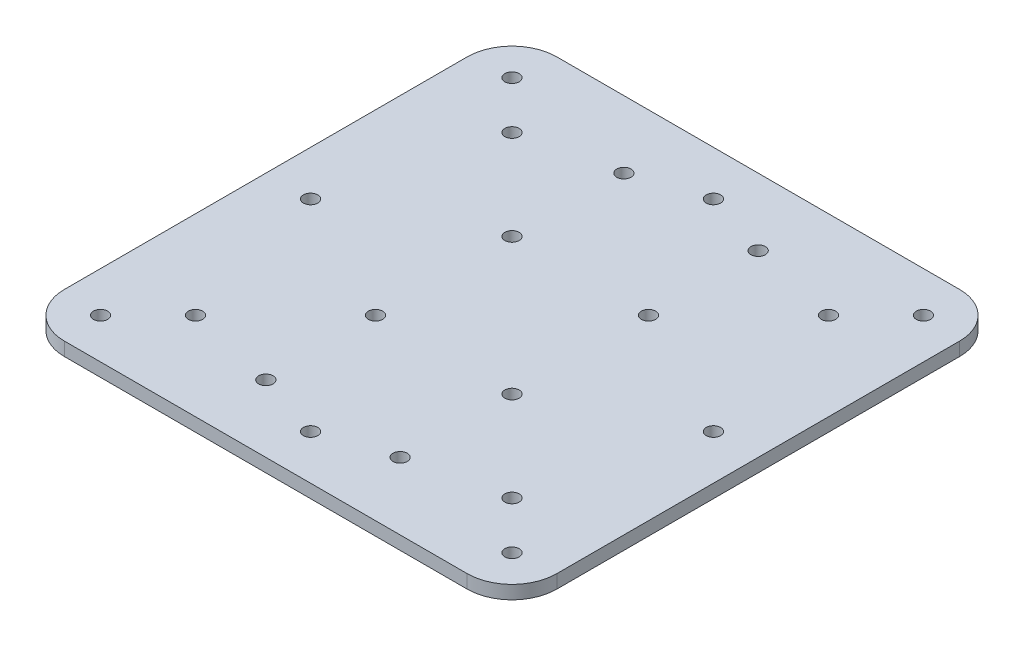
ISO-10303-21;
HEADER;
FILE_DESCRIPTION(('STEP AP214'),'2;1');
FILE_NAME('part.step','',(''),(''),'','','');
FILE_SCHEMA(('AUTOMOTIVE_DESIGN { 1 0 10303 214 1 1 1 1 }'));
ENDSEC;
DATA;
#1=APPLICATION_CONTEXT('core data for automotive mechanical design processes');
#2=APPLICATION_PROTOCOL_DEFINITION('international standard','automotive_design',2000,#1);
#3=PRODUCT_CONTEXT('',#1,'mechanical');
#4=PRODUCT('Part','Part','',(#3));
#5=PRODUCT_RELATED_PRODUCT_CATEGORY('part','',(#4));
#6=PRODUCT_DEFINITION_FORMATION('','',#4);
#7=PRODUCT_DEFINITION_CONTEXT('part definition',#1,'design');
#8=PRODUCT_DEFINITION('design','',#6,#7);
#9=PRODUCT_DEFINITION_SHAPE('','',#8);
#10=(LENGTH_UNIT() NAMED_UNIT(*) SI_UNIT(.MILLI.,.METRE.));
#11=(NAMED_UNIT(*) PLANE_ANGLE_UNIT() SI_UNIT($,.RADIAN.));
#12=(NAMED_UNIT(*) SI_UNIT($,.STERADIAN.) SOLID_ANGLE_UNIT());
#13=UNCERTAINTY_MEASURE_WITH_UNIT(LENGTH_MEASURE(1.E-05),#10,'distance_accuracy_value','');
#14=(GEOMETRIC_REPRESENTATION_CONTEXT(3) GLOBAL_UNCERTAINTY_ASSIGNED_CONTEXT((#13)) GLOBAL_UNIT_ASSIGNED_CONTEXT((#10,
#11,#12)) REPRESENTATION_CONTEXT('',''));
#15=CARTESIAN_POINT('',(0.,0.,0.));
#16=DIRECTION('',(0.,0.,1.));
#17=DIRECTION('',(1.,0.,0.));
#18=AXIS2_PLACEMENT_3D('',#15,#16,#17);
#19=CARTESIAN_POINT('',(0.,3.,0.));
#20=DIRECTION('',(0.,1.,0.));
#21=DIRECTION('',(0.,0.,1.));
#22=AXIS2_PLACEMENT_3D('',#19,#20,#21);
#23=PLANE('',#22);
#24=CARTESIAN_POINT('',(-15.,3.,-40.));
#25=DIRECTION('',(0.,1.,0.));
#26=DIRECTION('',(0.,0.,1.));
#27=AXIS2_PLACEMENT_3D('',#24,#25,#26);
#28=CIRCLE('',#27,1.6);
#29=CARTESIAN_POINT('',(-15.,3.,-38.4));
#30=VERTEX_POINT('',#29);
#31=EDGE_CURVE('E286',#30,#30,#28,.T.);
#32=ORIENTED_EDGE('',*,*,#31,.F.);
#33=EDGE_LOOP('',(#32));
#34=FACE_BOUND('',#33,.T.);
#35=CARTESIAN_POINT('',(-15.,3.,40.));
#36=DIRECTION('',(0.,1.,0.));
#37=DIRECTION('',(0.,0.,1.));
#38=AXIS2_PLACEMENT_3D('',#35,#36,#37);
#39=CIRCLE('',#38,1.6);
#40=CARTESIAN_POINT('',(-15.,3.,41.6));
#41=VERTEX_POINT('',#40);
#42=EDGE_CURVE('E277',#41,#41,#39,.T.);
#43=ORIENTED_EDGE('',*,*,#42,.F.);
#44=EDGE_LOOP('',(#43));
#45=FACE_BOUND('',#44,.T.);
#46=CARTESIAN_POINT('',(45.,3.,0.));
#47=DIRECTION('',(0.,1.,0.));
#48=DIRECTION('',(0.,0.,1.));
#49=AXIS2_PLACEMENT_3D('',#46,#47,#48);
#50=CIRCLE('',#49,1.6);
#51=CARTESIAN_POINT('',(45.,3.,1.6));
#52=VERTEX_POINT('',#51);
#53=EDGE_CURVE('E262',#52,#52,#50,.T.);
#54=ORIENTED_EDGE('',*,*,#53,.F.);
#55=EDGE_LOOP('',(#54));
#56=FACE_BOUND('',#55,.T.);
#57=CARTESIAN_POINT('',(0.,3.,-45.));
#58=DIRECTION('',(0.,1.,0.));
#59=DIRECTION('',(0.,0.,1.));
#60=AXIS2_PLACEMENT_3D('',#57,#58,#59);
#61=CIRCLE('',#60,1.6);
#62=CARTESIAN_POINT('',(0.,3.,-43.4));
#63=VERTEX_POINT('',#62);
#64=EDGE_CURVE('E252',#63,#63,#61,.T.);
#65=ORIENTED_EDGE('',*,*,#64,.F.);
#66=EDGE_LOOP('',(#65));
#67=FACE_BOUND('',#66,.T.);
#68=CARTESIAN_POINT('',(-45.9619,3.,45.9619));
#69=DIRECTION('',(0.,1.,0.));
#70=DIRECTION('',(0.,0.,1.));
#71=AXIS2_PLACEMENT_3D('',#68,#69,#70);
#72=CIRCLE('',#71,1.6);
#73=CARTESIAN_POINT('',(-45.9619,3.,47.5619));
#74=VERTEX_POINT('',#73);
#75=EDGE_CURVE('E238',#74,#74,#72,.T.);
#76=ORIENTED_EDGE('',*,*,#75,.F.);
#77=EDGE_LOOP('',(#76));
#78=FACE_BOUND('',#77,.T.);
#79=CARTESIAN_POINT('',(45.9619,3.,45.9619));
#80=DIRECTION('',(0.,1.,0.));
#81=DIRECTION('',(0.,0.,-1.));
#82=AXIS2_PLACEMENT_3D('',#79,#80,#81);
#83=CIRCLE('',#82,1.6);
#84=CARTESIAN_POINT('',(45.9619,3.,44.3619));
#85=VERTEX_POINT('',#84);
#86=EDGE_CURVE('E230',#85,#85,#83,.T.);
#87=ORIENTED_EDGE('',*,*,#86,.F.);
#88=EDGE_LOOP('',(#87));
#89=FACE_BOUND('',#88,.T.);
#90=CARTESIAN_POINT('',(-35.3553,3.,-35.3553));
#91=DIRECTION('',(0.,1.,0.));
#92=DIRECTION('',(0.,0.,-1.));
#93=AXIS2_PLACEMENT_3D('',#90,#91,#92);
#94=CIRCLE('',#93,1.6);
#95=CARTESIAN_POINT('',(-35.3553,3.,-36.9553));
#96=VERTEX_POINT('',#95);
#97=EDGE_CURVE('E216',#96,#96,#94,.T.);
#98=ORIENTED_EDGE('',*,*,#97,.F.);
#99=EDGE_LOOP('',(#98));
#100=FACE_BOUND('',#99,.T.);
#101=CARTESIAN_POINT('',(35.3553,3.,-35.3553));
#102=DIRECTION('',(0.,1.,0.));
#103=DIRECTION('',(0.,0.,1.));
#104=AXIS2_PLACEMENT_3D('',#101,#102,#103);
#105=CIRCLE('',#104,1.6);
#106=CARTESIAN_POINT('',(35.3553,3.,-33.7553));
#107=VERTEX_POINT('',#106);
#108=EDGE_CURVE('E204',#107,#107,#105,.T.);
#109=ORIENTED_EDGE('',*,*,#108,.F.);
#110=EDGE_LOOP('',(#109));
#111=FACE_BOUND('',#110,.T.);
#112=CARTESIAN_POINT('',(-15.25,3.,15.25));
#113=DIRECTION('',(0.,1.,0.));
#114=DIRECTION('',(0.,0.,1.));
#115=AXIS2_PLACEMENT_3D('',#112,#113,#114);
#116=CIRCLE('',#115,1.6);
#117=CARTESIAN_POINT('',(-15.25,3.,16.85));
#118=VERTEX_POINT('',#117);
#119=EDGE_CURVE('E195',#118,#118,#116,.T.);
#120=ORIENTED_EDGE('',*,*,#119,.F.);
#121=EDGE_LOOP('',(#120));
#122=FACE_BOUND('',#121,.T.);
#123=CARTESIAN_POINT('',(15.25,3.,-15.25));
#124=DIRECTION('',(0.,1.,0.));
#125=DIRECTION('',(0.,0.,1.));
#126=AXIS2_PLACEMENT_3D('',#123,#124,#125);
#127=CIRCLE('',#126,1.6);
#128=CARTESIAN_POINT('',(15.25,3.,-13.65));
#129=VERTEX_POINT('',#128);
#130=EDGE_CURVE('E133',#129,#129,#127,.T.);
#131=ORIENTED_EDGE('',*,*,#130,.F.);
#132=EDGE_LOOP('',(#131));
#133=FACE_BOUND('',#132,.T.);
#134=DIRECTION('',(1.,0.,0.));
#135=VECTOR('',#134,1.);
#136=CARTESIAN_POINT('',(-55.,3.,55.));
#137=LINE('',#136,#135);
#138=CARTESIAN_POINT('',(-45.,3.,55.));
#139=VERTEX_POINT('',#138);
#140=CARTESIAN_POINT('',(45.,3.,55.));
#141=VERTEX_POINT('',#140);
#142=EDGE_CURVE('E141',#139,#141,#137,.T.);
#143=ORIENTED_EDGE('',*,*,#142,.T.);
#144=CARTESIAN_POINT('',(45.,3.,45.));
#145=DIRECTION('',(0.,1.,0.));
#146=DIRECTION('',(0.,0.,1.));
#147=AXIS2_PLACEMENT_3D('',#144,#145,#146);
#148=CIRCLE('',#147,10.);
#149=CARTESIAN_POINT('',(55.,3.,45.));
#150=VERTEX_POINT('',#149);
#151=EDGE_CURVE('E165',#141,#150,#148,.T.);
#152=ORIENTED_EDGE('',*,*,#151,.T.);
#153=DIRECTION('',(0.,0.,-1.));
#154=VECTOR('',#153,1.);
#155=CARTESIAN_POINT('',(55.,3.,-55.));
#156=LINE('',#155,#154);
#157=CARTESIAN_POINT('',(55.,3.,-45.));
#158=VERTEX_POINT('',#157);
#159=EDGE_CURVE('E127',#150,#158,#156,.T.);
#160=ORIENTED_EDGE('',*,*,#159,.T.);
#161=CARTESIAN_POINT('',(45.,3.,-45.));
#162=DIRECTION('',(0.,1.,0.));
#163=DIRECTION('',(0.,0.,1.));
#164=AXIS2_PLACEMENT_3D('',#161,#162,#163);
#165=CIRCLE('',#164,10.);
#166=CARTESIAN_POINT('',(45.,3.,-55.));
#167=VERTEX_POINT('',#166);
#168=EDGE_CURVE('E159',#158,#167,#165,.T.);
#169=ORIENTED_EDGE('',*,*,#168,.T.);
#170=DIRECTION('',(-1.,0.,0.));
#171=VECTOR('',#170,1.);
#172=CARTESIAN_POINT('',(-55.,3.,-55.));
#173=LINE('',#172,#171);
#174=CARTESIAN_POINT('',(-45.,3.,-55.));
#175=VERTEX_POINT('',#174);
#176=EDGE_CURVE('E185',#167,#175,#173,.T.);
#177=ORIENTED_EDGE('',*,*,#176,.T.);
#178=CARTESIAN_POINT('',(-45.,3.,-45.));
#179=DIRECTION('',(0.,1.,0.));
#180=DIRECTION('',(0.,0.,1.));
#181=AXIS2_PLACEMENT_3D('',#178,#179,#180);
#182=CIRCLE('',#181,10.);
#183=CARTESIAN_POINT('',(-55.,3.,-45.));
#184=VERTEX_POINT('',#183);
#185=EDGE_CURVE('E64',#175,#184,#182,.T.);
#186=ORIENTED_EDGE('',*,*,#185,.T.);
#187=DIRECTION('',(0.,0.,1.));
#188=VECTOR('',#187,1.);
#189=CARTESIAN_POINT('',(-55.,3.,-55.));
#190=LINE('',#189,#188);
#191=CARTESIAN_POINT('',(-55.,3.,45.));
#192=VERTEX_POINT('',#191);
#193=EDGE_CURVE('E171',#184,#192,#190,.T.);
#194=ORIENTED_EDGE('',*,*,#193,.T.);
#195=CARTESIAN_POINT('',(-45.,3.,45.));
#196=DIRECTION('',(0.,1.,0.));
#197=DIRECTION('',(0.,0.,1.));
#198=AXIS2_PLACEMENT_3D('',#195,#196,#197);
#199=CIRCLE('',#198,10.);
#200=EDGE_CURVE('E158',#192,#139,#199,.T.);
#201=ORIENTED_EDGE('',*,*,#200,.T.);
#202=EDGE_LOOP('',(#143,#152,#160,#169,#177,#186,#194,#201));
#203=FACE_BOUND('',#202,.T.);
#204=CARTESIAN_POINT('',(-15.25,3.,-15.25));
#205=DIRECTION('',(0.,1.,0.));
#206=DIRECTION('',(0.,0.,-1.));
#207=AXIS2_PLACEMENT_3D('',#204,#205,#206);
#208=CIRCLE('',#207,1.6);
#209=CARTESIAN_POINT('',(-15.25,3.,-16.85));
#210=VERTEX_POINT('',#209);
#211=EDGE_CURVE('E186',#210,#210,#208,.T.);
#212=ORIENTED_EDGE('',*,*,#211,.F.);
#213=EDGE_LOOP('',(#212));
#214=FACE_BOUND('',#213,.T.);
#215=CARTESIAN_POINT('',(15.25,3.,15.25));
#216=DIRECTION('',(0.,1.,0.));
#217=DIRECTION('',(0.,0.,-1.));
#218=AXIS2_PLACEMENT_3D('',#215,#216,#217);
#219=CIRCLE('',#218,1.6);
#220=CARTESIAN_POINT('',(15.25,3.,13.65));
#221=VERTEX_POINT('',#220);
#222=EDGE_CURVE('E196',#221,#221,#219,.T.);
#223=ORIENTED_EDGE('',*,*,#222,.F.);
#224=EDGE_LOOP('',(#223));
#225=FACE_BOUND('',#224,.T.);
#226=CARTESIAN_POINT('',(45.9619,3.,-45.9619));
#227=DIRECTION('',(0.,1.,0.));
#228=DIRECTION('',(0.,0.,1.));
#229=AXIS2_PLACEMENT_3D('',#226,#227,#228);
#230=CIRCLE('',#229,1.6);
#231=CARTESIAN_POINT('',(45.9619,3.,-44.3619));
#232=VERTEX_POINT('',#231);
#233=EDGE_CURVE('E209',#232,#232,#230,.T.);
#234=ORIENTED_EDGE('',*,*,#233,.F.);
#235=EDGE_LOOP('',(#234));
#236=FACE_BOUND('',#235,.T.);
#237=CARTESIAN_POINT('',(-45.9619,3.,-45.9619));
#238=DIRECTION('',(0.,1.,0.));
#239=DIRECTION('',(0.,0.,-1.));
#240=AXIS2_PLACEMENT_3D('',#237,#238,#239);
#241=CIRCLE('',#240,1.6);
#242=CARTESIAN_POINT('',(-45.9619,3.,-47.5619));
#243=VERTEX_POINT('',#242);
#244=EDGE_CURVE('E225',#243,#243,#241,.T.);
#245=ORIENTED_EDGE('',*,*,#244,.F.);
#246=EDGE_LOOP('',(#245));
#247=FACE_BOUND('',#246,.T.);
#248=CARTESIAN_POINT('',(35.3553,3.,35.3553));
#249=DIRECTION('',(0.,1.,0.));
#250=DIRECTION('',(0.,0.,-1.));
#251=AXIS2_PLACEMENT_3D('',#248,#249,#250);
#252=CIRCLE('',#251,1.6);
#253=CARTESIAN_POINT('',(35.3553,3.,33.7553));
#254=VERTEX_POINT('',#253);
#255=EDGE_CURVE('E232',#254,#254,#252,.T.);
#256=ORIENTED_EDGE('',*,*,#255,.F.);
#257=EDGE_LOOP('',(#256));
#258=FACE_BOUND('',#257,.T.);
#259=CARTESIAN_POINT('',(-35.3553,3.,35.3553));
#260=DIRECTION('',(0.,1.,0.));
#261=DIRECTION('',(0.,0.,1.));
#262=AXIS2_PLACEMENT_3D('',#259,#260,#261);
#263=CIRCLE('',#262,1.6);
#264=CARTESIAN_POINT('',(-35.3553,3.,36.9553));
#265=VERTEX_POINT('',#264);
#266=EDGE_CURVE('E248',#265,#265,#263,.T.);
#267=ORIENTED_EDGE('',*,*,#266,.F.);
#268=EDGE_LOOP('',(#267));
#269=FACE_BOUND('',#268,.T.);
#270=CARTESIAN_POINT('',(-45.,3.,0.));
#271=DIRECTION('',(0.,1.,0.));
#272=DIRECTION('',(0.,0.,1.));
#273=AXIS2_PLACEMENT_3D('',#270,#271,#272);
#274=CIRCLE('',#273,1.6);
#275=CARTESIAN_POINT('',(-45.,3.,1.6));
#276=VERTEX_POINT('',#275);
#277=EDGE_CURVE('E256',#276,#276,#274,.T.);
#278=ORIENTED_EDGE('',*,*,#277,.F.);
#279=EDGE_LOOP('',(#278));
#280=FACE_BOUND('',#279,.T.);
#281=CARTESIAN_POINT('',(0.,3.,45.));
#282=DIRECTION('',(0.,1.,0.));
#283=DIRECTION('',(0.,0.,1.));
#284=AXIS2_PLACEMENT_3D('',#281,#282,#283);
#285=CIRCLE('',#284,1.6);
#286=CARTESIAN_POINT('',(0.,3.,46.6));
#287=VERTEX_POINT('',#286);
#288=EDGE_CURVE('E269',#287,#287,#285,.T.);
#289=ORIENTED_EDGE('',*,*,#288,.F.);
#290=EDGE_LOOP('',(#289));
#291=FACE_BOUND('',#290,.T.);
#292=CARTESIAN_POINT('',(15.,3.,40.));
#293=DIRECTION('',(0.,1.,0.));
#294=DIRECTION('',(0.,0.,1.));
#295=AXIS2_PLACEMENT_3D('',#292,#293,#294);
#296=CIRCLE('',#295,1.6);
#297=CARTESIAN_POINT('',(15.,3.,41.6));
#298=VERTEX_POINT('',#297);
#299=EDGE_CURVE('E281',#298,#298,#296,.T.);
#300=ORIENTED_EDGE('',*,*,#299,.F.);
#301=EDGE_LOOP('',(#300));
#302=FACE_BOUND('',#301,.T.);
#303=CARTESIAN_POINT('',(15.,3.,-40.));
#304=DIRECTION('',(0.,1.,0.));
#305=DIRECTION('',(0.,0.,1.));
#306=AXIS2_PLACEMENT_3D('',#303,#304,#305);
#307=CIRCLE('',#306,1.6);
#308=CARTESIAN_POINT('',(15.,3.,-38.4));
#309=VERTEX_POINT('',#308);
#310=EDGE_CURVE('E294',#309,#309,#307,.T.);
#311=ORIENTED_EDGE('',*,*,#310,.F.);
#312=EDGE_LOOP('',(#311));
#313=FACE_BOUND('',#312,.T.);
#314=ADVANCED_FACE('F41',(#34,#45,#56,#67,#78,#89,#100,#111,#122,#133,#203,#214,#225,#236,#247,
#258,#269,#280,#291,#302,#313),#23,.T.);
#315=CARTESIAN_POINT('',(0.,0.,0.));
#316=DIRECTION('',(0.,1.,0.));
#317=DIRECTION('',(0.,0.,1.));
#318=AXIS2_PLACEMENT_3D('',#315,#316,#317);
#319=PLANE('',#318);
#320=DIRECTION('',(0.,0.,-1.));
#321=VECTOR('',#320,1.);
#322=CARTESIAN_POINT('',(55.,0.,-55.));
#323=LINE('',#322,#321);
#324=CARTESIAN_POINT('',(55.,0.,45.));
#325=VERTEX_POINT('',#324);
#326=CARTESIAN_POINT('',(55.,0.,-45.));
#327=VERTEX_POINT('',#326);
#328=EDGE_CURVE('E121',#325,#327,#323,.T.);
#329=ORIENTED_EDGE('',*,*,#328,.F.);
#330=CARTESIAN_POINT('',(45.,0.,45.));
#331=DIRECTION('',(0.,1.,0.));
#332=DIRECTION('',(0.,0.,1.));
#333=AXIS2_PLACEMENT_3D('',#330,#331,#332);
#334=CIRCLE('',#333,10.);
#335=CARTESIAN_POINT('',(45.,0.,55.));
#336=VERTEX_POINT('',#335);
#337=EDGE_CURVE('E106',#325,#336,#334,.F.);
#338=ORIENTED_EDGE('',*,*,#337,.T.);
#339=DIRECTION('',(1.,0.,0.));
#340=VECTOR('',#339,1.);
#341=CARTESIAN_POINT('',(-55.,0.,55.));
#342=LINE('',#341,#340);
#343=CARTESIAN_POINT('',(-45.,0.,55.));
#344=VERTEX_POINT('',#343);
#345=EDGE_CURVE('E150',#344,#336,#342,.T.);
#346=ORIENTED_EDGE('',*,*,#345,.F.);
#347=CARTESIAN_POINT('',(-45.,0.,45.));
#348=DIRECTION('',(0.,1.,0.));
#349=DIRECTION('',(0.,0.,1.));
#350=AXIS2_PLACEMENT_3D('',#347,#348,#349);
#351=CIRCLE('',#350,10.);
#352=CARTESIAN_POINT('',(-55.,0.,45.));
#353=VERTEX_POINT('',#352);
#354=EDGE_CURVE('E151',#344,#353,#351,.F.);
#355=ORIENTED_EDGE('',*,*,#354,.T.);
#356=DIRECTION('',(0.,0.,1.));
#357=VECTOR('',#356,1.);
#358=CARTESIAN_POINT('',(-55.,0.,-55.));
#359=LINE('',#358,#357);
#360=CARTESIAN_POINT('',(-55.,0.,-45.));
#361=VERTEX_POINT('',#360);
#362=EDGE_CURVE('E140',#361,#353,#359,.T.);
#363=ORIENTED_EDGE('',*,*,#362,.F.);
#364=CARTESIAN_POINT('',(-45.,0.,-45.));
#365=DIRECTION('',(0.,1.,0.));
#366=DIRECTION('',(0.,0.,1.));
#367=AXIS2_PLACEMENT_3D('',#364,#365,#366);
#368=CIRCLE('',#367,10.);
#369=CARTESIAN_POINT('',(-45.,0.,-55.));
#370=VERTEX_POINT('',#369);
#371=EDGE_CURVE('E130',#361,#370,#368,.F.);
#372=ORIENTED_EDGE('',*,*,#371,.T.);
#373=DIRECTION('',(-1.,0.,0.));
#374=VECTOR('',#373,1.);
#375=CARTESIAN_POINT('',(-55.,0.,-55.));
#376=LINE('',#375,#374);
#377=CARTESIAN_POINT('',(45.,0.,-55.));
#378=VERTEX_POINT('',#377);
#379=EDGE_CURVE('E135',#378,#370,#376,.T.);
#380=ORIENTED_EDGE('',*,*,#379,.F.);
#381=CARTESIAN_POINT('',(45.,0.,-45.));
#382=DIRECTION('',(0.,1.,0.));
#383=DIRECTION('',(0.,0.,1.));
#384=AXIS2_PLACEMENT_3D('',#381,#382,#383);
#385=CIRCLE('',#384,10.);
#386=EDGE_CURVE('E116',#378,#327,#385,.F.);
#387=ORIENTED_EDGE('',*,*,#386,.T.);
#388=EDGE_LOOP('',(#329,#338,#346,#355,#363,#372,#380,#387));
#389=FACE_BOUND('',#388,.T.);
#390=CARTESIAN_POINT('',(15.25,0.,-15.25));
#391=DIRECTION('',(0.,1.,0.));
#392=DIRECTION('',(0.,0.,1.));
#393=AXIS2_PLACEMENT_3D('',#390,#391,#392);
#394=CIRCLE('',#393,1.6);
#395=CARTESIAN_POINT('',(15.25,0.,-13.65));
#396=VERTEX_POINT('',#395);
#397=EDGE_CURVE('E139',#396,#396,#394,.T.);
#398=ORIENTED_EDGE('',*,*,#397,.T.);
#399=EDGE_LOOP('',(#398));
#400=FACE_BOUND('',#399,.T.);
#401=CARTESIAN_POINT('',(-15.25,0.,-15.25));
#402=DIRECTION('',(0.,1.,0.));
#403=DIRECTION('',(0.,0.,-1.));
#404=AXIS2_PLACEMENT_3D('',#401,#402,#403);
#405=CIRCLE('',#404,1.6);
#406=CARTESIAN_POINT('',(-15.25,0.,-16.85));
#407=VERTEX_POINT('',#406);
#408=EDGE_CURVE('E188',#407,#407,#405,.T.);
#409=ORIENTED_EDGE('',*,*,#408,.T.);
#410=EDGE_LOOP('',(#409));
#411=FACE_BOUND('',#410,.T.);
#412=CARTESIAN_POINT('',(-15.25,0.,15.25));
#413=DIRECTION('',(0.,1.,0.));
#414=DIRECTION('',(0.,0.,1.));
#415=AXIS2_PLACEMENT_3D('',#412,#413,#414);
#416=CIRCLE('',#415,1.6);
#417=CARTESIAN_POINT('',(-15.25,0.,16.85));
#418=VERTEX_POINT('',#417);
#419=EDGE_CURVE('E194',#418,#418,#416,.T.);
#420=ORIENTED_EDGE('',*,*,#419,.T.);
#421=EDGE_LOOP('',(#420));
#422=FACE_BOUND('',#421,.T.);
#423=CARTESIAN_POINT('',(15.25,0.,15.25));
#424=DIRECTION('',(0.,1.,0.));
#425=DIRECTION('',(0.,0.,-1.));
#426=AXIS2_PLACEMENT_3D('',#423,#424,#425);
#427=CIRCLE('',#426,1.6);
#428=CARTESIAN_POINT('',(15.25,0.,13.65));
#429=VERTEX_POINT('',#428);
#430=EDGE_CURVE('E203',#429,#429,#427,.T.);
#431=ORIENTED_EDGE('',*,*,#430,.T.);
#432=EDGE_LOOP('',(#431));
#433=FACE_BOUND('',#432,.T.);
#434=CARTESIAN_POINT('',(35.3553,0.,-35.3553));
#435=DIRECTION('',(0.,1.,0.));
#436=DIRECTION('',(0.,0.,1.));
#437=AXIS2_PLACEMENT_3D('',#434,#435,#436);
#438=CIRCLE('',#437,1.6);
#439=CARTESIAN_POINT('',(35.3553,0.,-33.7553));
#440=VERTEX_POINT('',#439);
#441=EDGE_CURVE('E210',#440,#440,#438,.T.);
#442=ORIENTED_EDGE('',*,*,#441,.T.);
#443=EDGE_LOOP('',(#442));
#444=FACE_BOUND('',#443,.T.);
#445=CARTESIAN_POINT('',(45.9619,0.,-45.9619));
#446=DIRECTION('',(0.,1.,0.));
#447=DIRECTION('',(0.,0.,1.));
#448=AXIS2_PLACEMENT_3D('',#445,#446,#447);
#449=CIRCLE('',#448,1.6);
#450=CARTESIAN_POINT('',(45.9619,0.,-44.3619));
#451=VERTEX_POINT('',#450);
#452=EDGE_CURVE('E213',#451,#451,#449,.T.);
#453=ORIENTED_EDGE('',*,*,#452,.T.);
#454=EDGE_LOOP('',(#453));
#455=FACE_BOUND('',#454,.T.);
#456=CARTESIAN_POINT('',(-35.3553,0.,-35.3553));
#457=DIRECTION('',(0.,1.,0.));
#458=DIRECTION('',(0.,0.,-1.));
#459=AXIS2_PLACEMENT_3D('',#456,#457,#458);
#460=CIRCLE('',#459,1.6);
#461=CARTESIAN_POINT('',(-35.3553,0.,-36.9553));
#462=VERTEX_POINT('',#461);
#463=EDGE_CURVE('E218',#462,#462,#460,.T.);
#464=ORIENTED_EDGE('',*,*,#463,.T.);
#465=EDGE_LOOP('',(#464));
#466=FACE_BOUND('',#465,.T.);
#467=CARTESIAN_POINT('',(-45.9619,0.,-45.9619));
#468=DIRECTION('',(0.,1.,0.));
#469=DIRECTION('',(0.,0.,-1.));
#470=AXIS2_PLACEMENT_3D('',#467,#468,#469);
#471=CIRCLE('',#470,1.6);
#472=CARTESIAN_POINT('',(-45.9619,0.,-47.5619));
#473=VERTEX_POINT('',#472);
#474=EDGE_CURVE('E223',#473,#473,#471,.T.);
#475=ORIENTED_EDGE('',*,*,#474,.T.);
#476=EDGE_LOOP('',(#475));
#477=FACE_BOUND('',#476,.T.);
#478=CARTESIAN_POINT('',(45.9619,0.,45.9619));
#479=DIRECTION('',(0.,1.,0.));
#480=DIRECTION('',(0.,0.,-1.));
#481=AXIS2_PLACEMENT_3D('',#478,#479,#480);
#482=CIRCLE('',#481,1.6);
#483=CARTESIAN_POINT('',(45.9619,0.,44.3619));
#484=VERTEX_POINT('',#483);
#485=EDGE_CURVE('E233',#484,#484,#482,.T.);
#486=ORIENTED_EDGE('',*,*,#485,.T.);
#487=EDGE_LOOP('',(#486));
#488=FACE_BOUND('',#487,.T.);
#489=CARTESIAN_POINT('',(35.3553,0.,35.3553));
#490=DIRECTION('',(0.,1.,0.));
#491=DIRECTION('',(0.,0.,-1.));
#492=AXIS2_PLACEMENT_3D('',#489,#490,#491);
#493=CIRCLE('',#492,1.6);
#494=CARTESIAN_POINT('',(35.3553,0.,33.7553));
#495=VERTEX_POINT('',#494);
#496=EDGE_CURVE('E240',#495,#495,#493,.T.);
#497=ORIENTED_EDGE('',*,*,#496,.T.);
#498=EDGE_LOOP('',(#497));
#499=FACE_BOUND('',#498,.T.);
#500=CARTESIAN_POINT('',(-45.9619,0.,45.9619));
#501=DIRECTION('',(0.,1.,0.));
#502=DIRECTION('',(0.,0.,1.));
#503=AXIS2_PLACEMENT_3D('',#500,#501,#502);
#504=CIRCLE('',#503,1.6);
#505=CARTESIAN_POINT('',(-45.9619,0.,47.5619));
#506=VERTEX_POINT('',#505);
#507=EDGE_CURVE('E245',#506,#506,#504,.T.);
#508=ORIENTED_EDGE('',*,*,#507,.T.);
#509=EDGE_LOOP('',(#508));
#510=FACE_BOUND('',#509,.T.);
#511=CARTESIAN_POINT('',(-35.3553,0.,35.3553));
#512=DIRECTION('',(0.,1.,0.));
#513=DIRECTION('',(0.,0.,1.));
#514=AXIS2_PLACEMENT_3D('',#511,#512,#513);
#515=CIRCLE('',#514,1.6);
#516=CARTESIAN_POINT('',(-35.3553,0.,36.9553));
#517=VERTEX_POINT('',#516);
#518=EDGE_CURVE('E247',#517,#517,#515,.T.);
#519=ORIENTED_EDGE('',*,*,#518,.T.);
#520=EDGE_LOOP('',(#519));
#521=FACE_BOUND('',#520,.T.);
#522=CARTESIAN_POINT('',(0.,0.,-45.));
#523=DIRECTION('',(0.,1.,0.));
#524=DIRECTION('',(0.,0.,1.));
#525=AXIS2_PLACEMENT_3D('',#522,#523,#524);
#526=CIRCLE('',#525,1.6);
#527=CARTESIAN_POINT('',(0.,0.,-43.4));
#528=VERTEX_POINT('',#527);
#529=EDGE_CURVE('E254',#528,#528,#526,.T.);
#530=ORIENTED_EDGE('',*,*,#529,.T.);
#531=EDGE_LOOP('',(#530));
#532=FACE_BOUND('',#531,.T.);
#533=CARTESIAN_POINT('',(-45.,0.,0.));
#534=DIRECTION('',(0.,1.,0.));
#535=DIRECTION('',(0.,0.,1.));
#536=AXIS2_PLACEMENT_3D('',#533,#534,#535);
#537=CIRCLE('',#536,1.6);
#538=CARTESIAN_POINT('',(-45.,0.,1.6));
#539=VERTEX_POINT('',#538);
#540=EDGE_CURVE('E261',#539,#539,#537,.T.);
#541=ORIENTED_EDGE('',*,*,#540,.T.);
#542=EDGE_LOOP('',(#541));
#543=FACE_BOUND('',#542,.T.);
#544=CARTESIAN_POINT('',(45.,0.,0.));
#545=DIRECTION('',(0.,1.,0.));
#546=DIRECTION('',(0.,0.,1.));
#547=AXIS2_PLACEMENT_3D('',#544,#545,#546);
#548=CIRCLE('',#547,1.6);
#549=CARTESIAN_POINT('',(45.,0.,1.6));
#550=VERTEX_POINT('',#549);
#551=EDGE_CURVE('E270',#550,#550,#548,.T.);
#552=ORIENTED_EDGE('',*,*,#551,.T.);
#553=EDGE_LOOP('',(#552));
#554=FACE_BOUND('',#553,.T.);
#555=CARTESIAN_POINT('',(0.,0.,45.));
#556=DIRECTION('',(0.,1.,0.));
#557=DIRECTION('',(0.,0.,1.));
#558=AXIS2_PLACEMENT_3D('',#555,#556,#557);
#559=CIRCLE('',#558,1.6);
#560=CARTESIAN_POINT('',(0.,0.,46.6));
#561=VERTEX_POINT('',#560);
#562=EDGE_CURVE('E272',#561,#561,#559,.T.);
#563=ORIENTED_EDGE('',*,*,#562,.T.);
#564=EDGE_LOOP('',(#563));
#565=FACE_BOUND('',#564,.T.);
#566=CARTESIAN_POINT('',(-15.,0.,40.));
#567=DIRECTION('',(0.,1.,0.));
#568=DIRECTION('',(0.,0.,1.));
#569=AXIS2_PLACEMENT_3D('',#566,#567,#568);
#570=CIRCLE('',#569,1.6);
#571=CARTESIAN_POINT('',(-15.,0.,41.6));
#572=VERTEX_POINT('',#571);
#573=EDGE_CURVE('E276',#572,#572,#570,.T.);
#574=ORIENTED_EDGE('',*,*,#573,.T.);
#575=EDGE_LOOP('',(#574));
#576=FACE_BOUND('',#575,.T.);
#577=CARTESIAN_POINT('',(15.,0.,40.));
#578=DIRECTION('',(0.,1.,0.));
#579=DIRECTION('',(0.,0.,1.));
#580=AXIS2_PLACEMENT_3D('',#577,#578,#579);
#581=CIRCLE('',#580,1.6);
#582=CARTESIAN_POINT('',(15.,0.,41.6));
#583=VERTEX_POINT('',#582);
#584=EDGE_CURVE('E282',#583,#583,#581,.T.);
#585=ORIENTED_EDGE('',*,*,#584,.T.);
#586=EDGE_LOOP('',(#585));
#587=FACE_BOUND('',#586,.T.);
#588=CARTESIAN_POINT('',(-15.,0.,-40.));
#589=DIRECTION('',(0.,1.,0.));
#590=DIRECTION('',(0.,0.,1.));
#591=AXIS2_PLACEMENT_3D('',#588,#589,#590);
#592=CIRCLE('',#591,1.6);
#593=CARTESIAN_POINT('',(-15.,0.,-38.4));
#594=VERTEX_POINT('',#593);
#595=EDGE_CURVE('E292',#594,#594,#592,.T.);
#596=ORIENTED_EDGE('',*,*,#595,.T.);
#597=EDGE_LOOP('',(#596));
#598=FACE_BOUND('',#597,.T.);
#599=CARTESIAN_POINT('',(15.,0.,-40.));
#600=DIRECTION('',(0.,1.,0.));
#601=DIRECTION('',(0.,0.,1.));
#602=AXIS2_PLACEMENT_3D('',#599,#600,#601);
#603=CIRCLE('',#602,1.6);
#604=CARTESIAN_POINT('',(15.,0.,-38.4));
#605=VERTEX_POINT('',#604);
#606=EDGE_CURVE('E296',#605,#605,#603,.T.);
#607=ORIENTED_EDGE('',*,*,#606,.T.);
#608=EDGE_LOOP('',(#607));
#609=FACE_BOUND('',#608,.T.);
#610=ADVANCED_FACE('F128',(#389,#400,#411,#422,#433,#444,#455,#466,#477,#488,#499,#510,#521,
#532,#543,#554,#565,#576,#587,#598,#609),#319,.F.);
#611=CARTESIAN_POINT('',(55.,3.,-55.));
#612=DIRECTION('',(-1.,0.,0.));
#613=DIRECTION('',(0.,0.,1.));
#614=AXIS2_PLACEMENT_3D('',#611,#612,#613);
#615=PLANE('',#614);
#616=ORIENTED_EDGE('',*,*,#159,.F.);
#617=DIRECTION('',(0.,-1.,0.));
#618=VECTOR('',#617,1.);
#619=CARTESIAN_POINT('',(55.,3.,45.));
#620=LINE('',#619,#618);
#621=EDGE_CURVE('E109',#150,#325,#620,.T.);
#622=ORIENTED_EDGE('',*,*,#621,.T.);
#623=ORIENTED_EDGE('',*,*,#328,.T.);
#624=DIRECTION('',(0.,-1.,0.));
#625=VECTOR('',#624,1.);
#626=CARTESIAN_POINT('',(55.,3.,-45.));
#627=LINE('',#626,#625);
#628=EDGE_CURVE('E126',#327,#158,#627,.F.);
#629=ORIENTED_EDGE('',*,*,#628,.T.);
#630=EDGE_LOOP('',(#616,#622,#623,#629));
#631=FACE_BOUND('',#630,.T.);
#632=ADVANCED_FACE('F125',(#631),#615,.F.);
#633=CARTESIAN_POINT('',(-55.,3.,-55.));
#634=DIRECTION('',(0.,0.,1.));
#635=DIRECTION('',(1.,0.,0.));
#636=AXIS2_PLACEMENT_3D('',#633,#634,#635);
#637=PLANE('',#636);
#638=ORIENTED_EDGE('',*,*,#176,.F.);
#639=DIRECTION('',(0.,-1.,0.));
#640=VECTOR('',#639,1.);
#641=CARTESIAN_POINT('',(45.,3.,-55.));
#642=LINE('',#641,#640);
#643=EDGE_CURVE('E167',#167,#378,#642,.T.);
#644=ORIENTED_EDGE('',*,*,#643,.T.);
#645=ORIENTED_EDGE('',*,*,#379,.T.);
#646=DIRECTION('',(0.,-1.,0.));
#647=VECTOR('',#646,1.);
#648=CARTESIAN_POINT('',(-45.,3.,-55.));
#649=LINE('',#648,#647);
#650=EDGE_CURVE('E163',#370,#175,#649,.F.);
#651=ORIENTED_EDGE('',*,*,#650,.T.);
#652=EDGE_LOOP('',(#638,#644,#645,#651));
#653=FACE_BOUND('',#652,.T.);
#654=ADVANCED_FACE('F322',(#653),#637,.F.);
#655=CARTESIAN_POINT('',(-55.,3.,-55.));
#656=DIRECTION('',(1.,0.,0.));
#657=DIRECTION('',(0.,0.,-1.));
#658=AXIS2_PLACEMENT_3D('',#655,#656,#657);
#659=PLANE('',#658);
#660=ORIENTED_EDGE('',*,*,#362,.T.);
#661=DIRECTION('',(0.,-1.,0.));
#662=VECTOR('',#661,1.);
#663=CARTESIAN_POINT('',(-55.,3.,45.));
#664=LINE('',#663,#662);
#665=EDGE_CURVE('E11',#353,#192,#664,.F.);
#666=ORIENTED_EDGE('',*,*,#665,.T.);
#667=ORIENTED_EDGE('',*,*,#193,.F.);
#668=DIRECTION('',(0.,-1.,0.));
#669=VECTOR('',#668,1.);
#670=CARTESIAN_POINT('',(-55.,3.,-45.));
#671=LINE('',#670,#669);
#672=EDGE_CURVE('E47',#184,#361,#671,.T.);
#673=ORIENTED_EDGE('',*,*,#672,.T.);
#674=EDGE_LOOP('',(#660,#666,#667,#673));
#675=FACE_BOUND('',#674,.T.);
#676=ADVANCED_FACE('F174',(#675),#659,.F.);
#677=CARTESIAN_POINT('',(-55.,3.,55.));
#678=DIRECTION('',(0.,0.,-1.));
#679=DIRECTION('',(-1.,0.,0.));
#680=AXIS2_PLACEMENT_3D('',#677,#678,#679);
#681=PLANE('',#680);
#682=ORIENTED_EDGE('',*,*,#345,.T.);
#683=DIRECTION('',(0.,-1.,0.));
#684=VECTOR('',#683,1.);
#685=CARTESIAN_POINT('',(45.,3.,55.));
#686=LINE('',#685,#684);
#687=EDGE_CURVE('E112',#336,#141,#686,.F.);
#688=ORIENTED_EDGE('',*,*,#687,.T.);
#689=ORIENTED_EDGE('',*,*,#142,.F.);
#690=DIRECTION('',(0.,-1.,0.));
#691=VECTOR('',#690,1.);
#692=CARTESIAN_POINT('',(-45.,3.,55.));
#693=LINE('',#692,#691);
#694=EDGE_CURVE('E119',#139,#344,#693,.T.);
#695=ORIENTED_EDGE('',*,*,#694,.T.);
#696=EDGE_LOOP('',(#682,#688,#689,#695));
#697=FACE_BOUND('',#696,.T.);
#698=ADVANCED_FACE('F179',(#697),#681,.F.);
#699=CARTESIAN_POINT('',(15.25,3.,-15.25));
#700=DIRECTION('',(0.,-1.,0.));
#701=DIRECTION('',(0.,0.,-1.));
#702=AXIS2_PLACEMENT_3D('',#699,#700,#701);
#703=CYLINDRICAL_SURFACE('',#702,1.6);
#704=ORIENTED_EDGE('',*,*,#130,.T.);
#705=EDGE_LOOP('',(#704));
#706=FACE_BOUND('',#705,.T.);
#707=ORIENTED_EDGE('',*,*,#397,.F.);
#708=EDGE_LOOP('',(#707));
#709=FACE_BOUND('',#708,.T.);
#710=ADVANCED_FACE('F320',(#706,#709),#703,.F.);
#711=CARTESIAN_POINT('',(-15.25,3.,-15.25));
#712=DIRECTION('',(0.,-1.,0.));
#713=DIRECTION('',(0.,0.,-1.));
#714=AXIS2_PLACEMENT_3D('',#711,#712,#713);
#715=CYLINDRICAL_SURFACE('',#714,1.6);
#716=ORIENTED_EDGE('',*,*,#211,.T.);
#717=EDGE_LOOP('',(#716));
#718=FACE_BOUND('',#717,.T.);
#719=ORIENTED_EDGE('',*,*,#408,.F.);
#720=EDGE_LOOP('',(#719));
#721=FACE_BOUND('',#720,.T.);
#722=ADVANCED_FACE('F439',(#718,#721),#715,.F.);
#723=CARTESIAN_POINT('',(-15.25,3.,15.25));
#724=DIRECTION('',(0.,-1.,0.));
#725=DIRECTION('',(0.,0.,-1.));
#726=AXIS2_PLACEMENT_3D('',#723,#724,#725);
#727=CYLINDRICAL_SURFACE('',#726,1.6);
#728=ORIENTED_EDGE('',*,*,#119,.T.);
#729=EDGE_LOOP('',(#728));
#730=FACE_BOUND('',#729,.T.);
#731=ORIENTED_EDGE('',*,*,#419,.F.);
#732=EDGE_LOOP('',(#731));
#733=FACE_BOUND('',#732,.T.);
#734=ADVANCED_FACE('F440',(#730,#733),#727,.F.);
#735=CARTESIAN_POINT('',(15.25,3.,15.25));
#736=DIRECTION('',(0.,-1.,0.));
#737=DIRECTION('',(0.,0.,-1.));
#738=AXIS2_PLACEMENT_3D('',#735,#736,#737);
#739=CYLINDRICAL_SURFACE('',#738,1.6);
#740=ORIENTED_EDGE('',*,*,#222,.T.);
#741=EDGE_LOOP('',(#740));
#742=FACE_BOUND('',#741,.T.);
#743=ORIENTED_EDGE('',*,*,#430,.F.);
#744=EDGE_LOOP('',(#743));
#745=FACE_BOUND('',#744,.T.);
#746=ADVANCED_FACE('F433',(#742,#745),#739,.F.);
#747=CARTESIAN_POINT('',(35.3553,3.,-35.3553));
#748=DIRECTION('',(0.,-1.,0.));
#749=DIRECTION('',(0.,0.,-1.));
#750=AXIS2_PLACEMENT_3D('',#747,#748,#749);
#751=CYLINDRICAL_SURFACE('',#750,1.6);
#752=ORIENTED_EDGE('',*,*,#108,.T.);
#753=EDGE_LOOP('',(#752));
#754=FACE_BOUND('',#753,.T.);
#755=ORIENTED_EDGE('',*,*,#441,.F.);
#756=EDGE_LOOP('',(#755));
#757=FACE_BOUND('',#756,.T.);
#758=ADVANCED_FACE('F427',(#754,#757),#751,.F.);
#759=CARTESIAN_POINT('',(45.9619,3.,-45.9619));
#760=DIRECTION('',(0.,-1.,0.));
#761=DIRECTION('',(0.,0.,-1.));
#762=AXIS2_PLACEMENT_3D('',#759,#760,#761);
#763=CYLINDRICAL_SURFACE('',#762,1.6);
#764=ORIENTED_EDGE('',*,*,#233,.T.);
#765=EDGE_LOOP('',(#764));
#766=FACE_BOUND('',#765,.T.);
#767=ORIENTED_EDGE('',*,*,#452,.F.);
#768=EDGE_LOOP('',(#767));
#769=FACE_BOUND('',#768,.T.);
#770=ADVANCED_FACE('F422',(#766,#769),#763,.F.);
#771=CARTESIAN_POINT('',(-35.3553,3.,-35.3553));
#772=DIRECTION('',(0.,-1.,0.));
#773=DIRECTION('',(0.,0.,-1.));
#774=AXIS2_PLACEMENT_3D('',#771,#772,#773);
#775=CYLINDRICAL_SURFACE('',#774,1.6);
#776=ORIENTED_EDGE('',*,*,#97,.T.);
#777=EDGE_LOOP('',(#776));
#778=FACE_BOUND('',#777,.T.);
#779=ORIENTED_EDGE('',*,*,#463,.F.);
#780=EDGE_LOOP('',(#779));
#781=FACE_BOUND('',#780,.T.);
#782=ADVANCED_FACE('F423',(#778,#781),#775,.F.);
#783=CARTESIAN_POINT('',(-45.9619,3.,-45.9619));
#784=DIRECTION('',(0.,-1.,0.));
#785=DIRECTION('',(0.,0.,-1.));
#786=AXIS2_PLACEMENT_3D('',#783,#784,#785);
#787=CYLINDRICAL_SURFACE('',#786,1.6);
#788=ORIENTED_EDGE('',*,*,#244,.T.);
#789=EDGE_LOOP('',(#788));
#790=FACE_BOUND('',#789,.T.);
#791=ORIENTED_EDGE('',*,*,#474,.F.);
#792=EDGE_LOOP('',(#791));
#793=FACE_BOUND('',#792,.T.);
#794=ADVANCED_FACE('F417',(#790,#793),#787,.F.);
#795=CARTESIAN_POINT('',(45.9619,3.,45.9619));
#796=DIRECTION('',(0.,-1.,0.));
#797=DIRECTION('',(0.,0.,-1.));
#798=AXIS2_PLACEMENT_3D('',#795,#796,#797);
#799=CYLINDRICAL_SURFACE('',#798,1.6);
#800=ORIENTED_EDGE('',*,*,#86,.T.);
#801=EDGE_LOOP('',(#800));
#802=FACE_BOUND('',#801,.T.);
#803=ORIENTED_EDGE('',*,*,#485,.F.);
#804=EDGE_LOOP('',(#803));
#805=FACE_BOUND('',#804,.T.);
#806=ADVANCED_FACE('F411',(#802,#805),#799,.F.);
#807=CARTESIAN_POINT('',(35.3553,3.,35.3553));
#808=DIRECTION('',(0.,-1.,0.));
#809=DIRECTION('',(0.,0.,-1.));
#810=AXIS2_PLACEMENT_3D('',#807,#808,#809);
#811=CYLINDRICAL_SURFACE('',#810,1.6);
#812=ORIENTED_EDGE('',*,*,#255,.T.);
#813=EDGE_LOOP('',(#812));
#814=FACE_BOUND('',#813,.T.);
#815=ORIENTED_EDGE('',*,*,#496,.F.);
#816=EDGE_LOOP('',(#815));
#817=FACE_BOUND('',#816,.T.);
#818=ADVANCED_FACE('F408',(#814,#817),#811,.F.);
#819=CARTESIAN_POINT('',(-45.9619,3.,45.9619));
#820=DIRECTION('',(0.,-1.,0.));
#821=DIRECTION('',(0.,0.,-1.));
#822=AXIS2_PLACEMENT_3D('',#819,#820,#821);
#823=CYLINDRICAL_SURFACE('',#822,1.6);
#824=ORIENTED_EDGE('',*,*,#75,.T.);
#825=EDGE_LOOP('',(#824));
#826=FACE_BOUND('',#825,.T.);
#827=ORIENTED_EDGE('',*,*,#507,.F.);
#828=EDGE_LOOP('',(#827));
#829=FACE_BOUND('',#828,.T.);
#830=ADVANCED_FACE('F403',(#826,#829),#823,.F.);
#831=CARTESIAN_POINT('',(-35.3553,3.,35.3553));
#832=DIRECTION('',(0.,-1.,0.));
#833=DIRECTION('',(0.,0.,-1.));
#834=AXIS2_PLACEMENT_3D('',#831,#832,#833);
#835=CYLINDRICAL_SURFACE('',#834,1.6);
#836=ORIENTED_EDGE('',*,*,#266,.T.);
#837=EDGE_LOOP('',(#836));
#838=FACE_BOUND('',#837,.T.);
#839=ORIENTED_EDGE('',*,*,#518,.F.);
#840=EDGE_LOOP('',(#839));
#841=FACE_BOUND('',#840,.T.);
#842=ADVANCED_FACE('F402',(#838,#841),#835,.F.);
#843=CARTESIAN_POINT('',(0.,3.,-45.));
#844=DIRECTION('',(0.,-1.,0.));
#845=DIRECTION('',(0.,0.,-1.));
#846=AXIS2_PLACEMENT_3D('',#843,#844,#845);
#847=CYLINDRICAL_SURFACE('',#846,1.6);
#848=ORIENTED_EDGE('',*,*,#64,.T.);
#849=EDGE_LOOP('',(#848));
#850=FACE_BOUND('',#849,.T.);
#851=ORIENTED_EDGE('',*,*,#529,.F.);
#852=EDGE_LOOP('',(#851));
#853=FACE_BOUND('',#852,.T.);
#854=ADVANCED_FACE('F400',(#850,#853),#847,.F.);
#855=CARTESIAN_POINT('',(-45.,3.,0.));
#856=DIRECTION('',(0.,-1.,0.));
#857=DIRECTION('',(0.,0.,-1.));
#858=AXIS2_PLACEMENT_3D('',#855,#856,#857);
#859=CYLINDRICAL_SURFACE('',#858,1.6);
#860=ORIENTED_EDGE('',*,*,#277,.T.);
#861=EDGE_LOOP('',(#860));
#862=FACE_BOUND('',#861,.T.);
#863=ORIENTED_EDGE('',*,*,#540,.F.);
#864=EDGE_LOOP('',(#863));
#865=FACE_BOUND('',#864,.T.);
#866=ADVANCED_FACE('F395',(#862,#865),#859,.F.);
#867=CARTESIAN_POINT('',(45.,3.,0.));
#868=DIRECTION('',(0.,-1.,0.));
#869=DIRECTION('',(0.,0.,-1.));
#870=AXIS2_PLACEMENT_3D('',#867,#868,#869);
#871=CYLINDRICAL_SURFACE('',#870,1.6);
#872=ORIENTED_EDGE('',*,*,#53,.T.);
#873=EDGE_LOOP('',(#872));
#874=FACE_BOUND('',#873,.T.);
#875=ORIENTED_EDGE('',*,*,#551,.F.);
#876=EDGE_LOOP('',(#875));
#877=FACE_BOUND('',#876,.T.);
#878=ADVANCED_FACE('F386',(#874,#877),#871,.F.);
#879=CARTESIAN_POINT('',(0.,3.,45.));
#880=DIRECTION('',(0.,-1.,0.));
#881=DIRECTION('',(0.,0.,-1.));
#882=AXIS2_PLACEMENT_3D('',#879,#880,#881);
#883=CYLINDRICAL_SURFACE('',#882,1.6);
#884=ORIENTED_EDGE('',*,*,#288,.T.);
#885=EDGE_LOOP('',(#884));
#886=FACE_BOUND('',#885,.T.);
#887=ORIENTED_EDGE('',*,*,#562,.F.);
#888=EDGE_LOOP('',(#887));
#889=FACE_BOUND('',#888,.T.);
#890=ADVANCED_FACE('F384',(#886,#889),#883,.F.);
#891=CARTESIAN_POINT('',(-15.,3.,40.));
#892=DIRECTION('',(0.,-1.,0.));
#893=DIRECTION('',(0.,0.,-1.));
#894=AXIS2_PLACEMENT_3D('',#891,#892,#893);
#895=CYLINDRICAL_SURFACE('',#894,1.6);
#896=ORIENTED_EDGE('',*,*,#42,.T.);
#897=EDGE_LOOP('',(#896));
#898=FACE_BOUND('',#897,.T.);
#899=ORIENTED_EDGE('',*,*,#573,.F.);
#900=EDGE_LOOP('',(#899));
#901=FACE_BOUND('',#900,.T.);
#902=ADVANCED_FACE('F366',(#898,#901),#895,.F.);
#903=CARTESIAN_POINT('',(15.,3.,40.));
#904=DIRECTION('',(0.,-1.,0.));
#905=DIRECTION('',(0.,0.,-1.));
#906=AXIS2_PLACEMENT_3D('',#903,#904,#905);
#907=CYLINDRICAL_SURFACE('',#906,1.6);
#908=ORIENTED_EDGE('',*,*,#299,.T.);
#909=EDGE_LOOP('',(#908));
#910=FACE_BOUND('',#909,.T.);
#911=ORIENTED_EDGE('',*,*,#584,.F.);
#912=EDGE_LOOP('',(#911));
#913=FACE_BOUND('',#912,.T.);
#914=ADVANCED_FACE('F365',(#910,#913),#907,.F.);
#915=CARTESIAN_POINT('',(-15.,3.,-40.));
#916=DIRECTION('',(0.,-1.,0.));
#917=DIRECTION('',(0.,0.,-1.));
#918=AXIS2_PLACEMENT_3D('',#915,#916,#917);
#919=CYLINDRICAL_SURFACE('',#918,1.6);
#920=ORIENTED_EDGE('',*,*,#31,.T.);
#921=EDGE_LOOP('',(#920));
#922=FACE_BOUND('',#921,.T.);
#923=ORIENTED_EDGE('',*,*,#595,.F.);
#924=EDGE_LOOP('',(#923));
#925=FACE_BOUND('',#924,.T.);
#926=ADVANCED_FACE('F370',(#922,#925),#919,.F.);
#927=CARTESIAN_POINT('',(15.,3.,-40.));
#928=DIRECTION('',(0.,-1.,0.));
#929=DIRECTION('',(0.,0.,-1.));
#930=AXIS2_PLACEMENT_3D('',#927,#928,#929);
#931=CYLINDRICAL_SURFACE('',#930,1.6);
#932=ORIENTED_EDGE('',*,*,#310,.T.);
#933=EDGE_LOOP('',(#932));
#934=FACE_BOUND('',#933,.T.);
#935=ORIENTED_EDGE('',*,*,#606,.F.);
#936=EDGE_LOOP('',(#935));
#937=FACE_BOUND('',#936,.T.);
#938=ADVANCED_FACE('F301',(#934,#937),#931,.F.);
#939=CARTESIAN_POINT('',(45.,3.,45.));
#940=DIRECTION('',(0.,-1.,0.));
#941=DIRECTION('',(0.,0.,-1.));
#942=AXIS2_PLACEMENT_3D('',#939,#940,#941);
#943=CYLINDRICAL_SURFACE('',#942,10.);
#944=ORIENTED_EDGE('',*,*,#151,.F.);
#945=ORIENTED_EDGE('',*,*,#687,.F.);
#946=ORIENTED_EDGE('',*,*,#337,.F.);
#947=ORIENTED_EDGE('',*,*,#621,.F.);
#948=EDGE_LOOP('',(#944,#945,#946,#947));
#949=FACE_BOUND('',#948,.T.);
#950=ADVANCED_FACE('F108',(#949),#943,.T.);
#951=CARTESIAN_POINT('',(45.,3.,-45.));
#952=DIRECTION('',(0.,-1.,0.));
#953=DIRECTION('',(0.,0.,-1.));
#954=AXIS2_PLACEMENT_3D('',#951,#952,#953);
#955=CYLINDRICAL_SURFACE('',#954,10.);
#956=ORIENTED_EDGE('',*,*,#168,.F.);
#957=ORIENTED_EDGE('',*,*,#628,.F.);
#958=ORIENTED_EDGE('',*,*,#386,.F.);
#959=ORIENTED_EDGE('',*,*,#643,.F.);
#960=EDGE_LOOP('',(#956,#957,#958,#959));
#961=FACE_BOUND('',#960,.T.);
#962=ADVANCED_FACE('F335',(#961),#955,.T.);
#963=CARTESIAN_POINT('',(-45.,3.,45.));
#964=DIRECTION('',(0.,-1.,0.));
#965=DIRECTION('',(0.,0.,-1.));
#966=AXIS2_PLACEMENT_3D('',#963,#964,#965);
#967=CYLINDRICAL_SURFACE('',#966,10.);
#968=ORIENTED_EDGE('',*,*,#200,.F.);
#969=ORIENTED_EDGE('',*,*,#665,.F.);
#970=ORIENTED_EDGE('',*,*,#354,.F.);
#971=ORIENTED_EDGE('',*,*,#694,.F.);
#972=EDGE_LOOP('',(#968,#969,#970,#971));
#973=FACE_BOUND('',#972,.T.);
#974=ADVANCED_FACE('F180',(#973),#967,.T.);
#975=CARTESIAN_POINT('',(-45.,3.,-45.));
#976=DIRECTION('',(0.,-1.,0.));
#977=DIRECTION('',(0.,0.,-1.));
#978=AXIS2_PLACEMENT_3D('',#975,#976,#977);
#979=CYLINDRICAL_SURFACE('',#978,10.);
#980=ORIENTED_EDGE('',*,*,#185,.F.);
#981=ORIENTED_EDGE('',*,*,#650,.F.);
#982=ORIENTED_EDGE('',*,*,#371,.F.);
#983=ORIENTED_EDGE('',*,*,#672,.F.);
#984=EDGE_LOOP('',(#980,#981,#982,#983));
#985=FACE_BOUND('',#984,.T.);
#986=ADVANCED_FACE('F43',(#985),#979,.T.);
#987=CLOSED_SHELL('',(#314,#610,#632,#654,#676,#698,#710,#722,#734,#746,#758,#770,#782,#794,
#806,#818,#830,#842,#854,#866,#878,#890,#902,#914,#926,#938,#950,#962,#974,#986));
#988=MANIFOLD_SOLID_BREP('B2',#987);
#989=ADVANCED_BREP_SHAPE_REPRESENTATION('',(#18,#988),#14);
#990=SHAPE_DEFINITION_REPRESENTATION(#9,#989);
ENDSEC;
END-ISO-10303-21;
